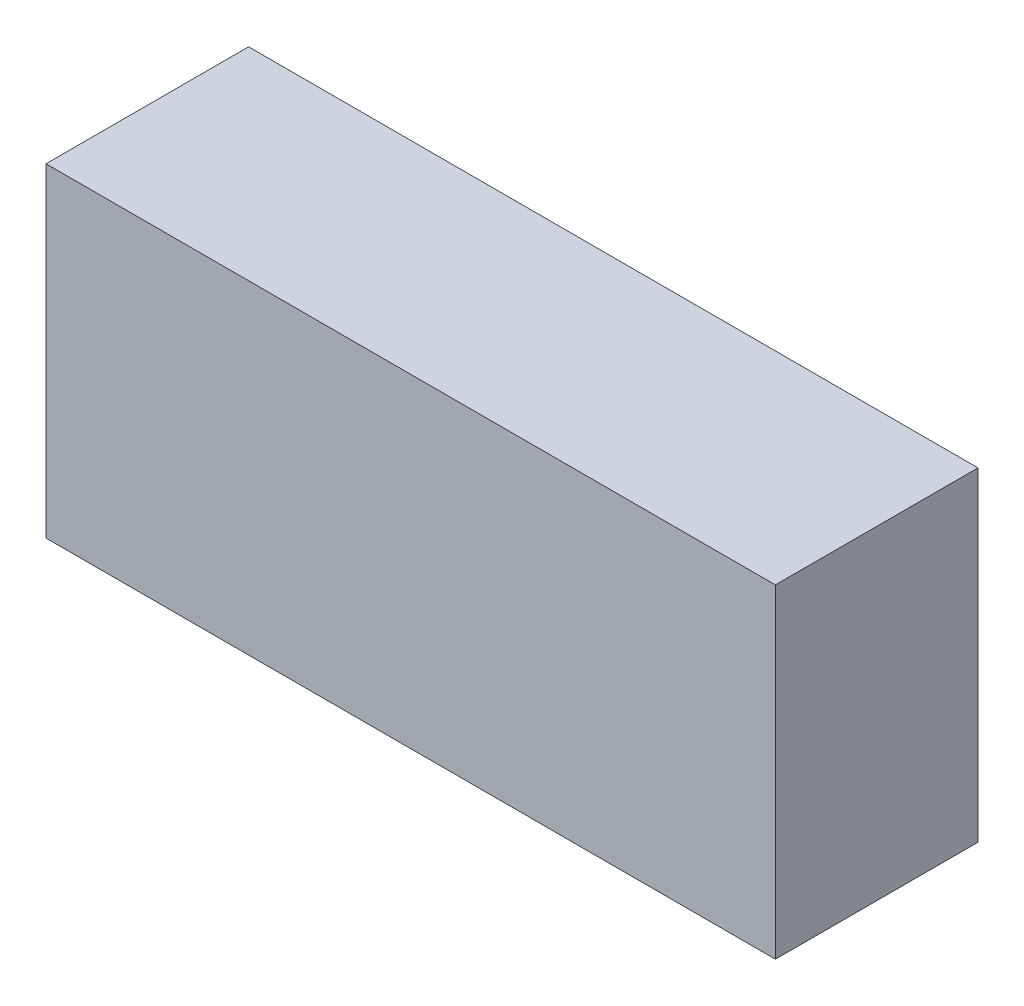
ISO-10303-21;
HEADER;
FILE_DESCRIPTION(('STEP AP214'),'2;1');
FILE_NAME('part.step','',(''),(''),'','','');
FILE_SCHEMA(('AUTOMOTIVE_DESIGN { 1 0 10303 214 1 1 1 1 }'));
ENDSEC;
DATA;
#1=APPLICATION_CONTEXT('core data for automotive mechanical design processes');
#2=APPLICATION_PROTOCOL_DEFINITION('international standard','automotive_design',2000,#1);
#3=PRODUCT_CONTEXT('',#1,'mechanical');
#4=PRODUCT('Part','Part','',(#3));
#5=PRODUCT_RELATED_PRODUCT_CATEGORY('part','',(#4));
#6=PRODUCT_DEFINITION_FORMATION('','',#4);
#7=PRODUCT_DEFINITION_CONTEXT('part definition',#1,'design');
#8=PRODUCT_DEFINITION('design','',#6,#7);
#9=PRODUCT_DEFINITION_SHAPE('','',#8);
#10=(LENGTH_UNIT() NAMED_UNIT(*) SI_UNIT(.MILLI.,.METRE.));
#11=(NAMED_UNIT(*) PLANE_ANGLE_UNIT() SI_UNIT($,.RADIAN.));
#12=(NAMED_UNIT(*) SI_UNIT($,.STERADIAN.) SOLID_ANGLE_UNIT());
#13=UNCERTAINTY_MEASURE_WITH_UNIT(LENGTH_MEASURE(1.E-05),#10,'distance_accuracy_value','');
#14=(GEOMETRIC_REPRESENTATION_CONTEXT(3) GLOBAL_UNCERTAINTY_ASSIGNED_CONTEXT((#13)) GLOBAL_UNIT_ASSIGNED_CONTEXT((#10,
#11,#12)) REPRESENTATION_CONTEXT('',''));
#15=CARTESIAN_POINT('',(0.,0.,0.));
#16=DIRECTION('',(0.,0.,1.));
#17=DIRECTION('',(1.,0.,0.));
#18=AXIS2_PLACEMENT_3D('',#15,#16,#17);
#19=CARTESIAN_POINT('',(36.,16.,10.));
#20=DIRECTION('',(-1.,0.,0.));
#21=DIRECTION('',(0.,-1.,0.));
#22=AXIS2_PLACEMENT_3D('',#19,#20,#21);
#23=PLANE('',#22);
#24=DIRECTION('',(0.,1.,0.));
#25=VECTOR('',#24,1.);
#26=CARTESIAN_POINT('',(36.,16.,-10.));
#27=LINE('',#26,#25);
#28=CARTESIAN_POINT('',(36.,-16.,-10.));
#29=VERTEX_POINT('',#28);
#30=CARTESIAN_POINT('',(36.,16.,-10.));
#31=VERTEX_POINT('',#30);
#32=EDGE_CURVE('E97',#29,#31,#27,.T.);
#33=ORIENTED_EDGE('',*,*,#32,.T.);
#34=DIRECTION('',(0.,0.,-1.));
#35=VECTOR('',#34,1.);
#36=CARTESIAN_POINT('',(36.,16.,10.));
#37=LINE('',#36,#35);
#38=CARTESIAN_POINT('',(36.,16.,10.));
#39=VERTEX_POINT('',#38);
#40=EDGE_CURVE('E11',#39,#31,#37,.T.);
#41=ORIENTED_EDGE('',*,*,#40,.F.);
#42=DIRECTION('',(0.,1.,0.));
#43=VECTOR('',#42,1.);
#44=CARTESIAN_POINT('',(36.,16.,10.));
#45=LINE('',#44,#43);
#46=CARTESIAN_POINT('',(36.,-16.,10.));
#47=VERTEX_POINT('',#46);
#48=EDGE_CURVE('E85',#47,#39,#45,.T.);
#49=ORIENTED_EDGE('',*,*,#48,.F.);
#50=DIRECTION('',(0.,0.,-1.));
#51=VECTOR('',#50,1.);
#52=CARTESIAN_POINT('',(36.,-16.,10.));
#53=LINE('',#52,#51);
#54=EDGE_CURVE('E93',#47,#29,#53,.T.);
#55=ORIENTED_EDGE('',*,*,#54,.T.);
#56=EDGE_LOOP('',(#33,#41,#49,#55));
#57=FACE_BOUND('',#56,.T.);
#58=ADVANCED_FACE('F34',(#57),#23,.F.);
#59=CARTESIAN_POINT('',(-36.,16.,10.));
#60=DIRECTION('',(0.,-1.,0.));
#61=DIRECTION('',(0.,0.,-1.));
#62=AXIS2_PLACEMENT_3D('',#59,#60,#61);
#63=PLANE('',#62);
#64=DIRECTION('',(-1.,0.,0.));
#65=VECTOR('',#64,1.);
#66=CARTESIAN_POINT('',(-36.,16.,-10.));
#67=LINE('',#66,#65);
#68=CARTESIAN_POINT('',(-36.,16.,-10.));
#69=VERTEX_POINT('',#68);
#70=EDGE_CURVE('E89',#31,#69,#67,.T.);
#71=ORIENTED_EDGE('',*,*,#70,.T.);
#72=DIRECTION('',(0.,0.,-1.));
#73=VECTOR('',#72,1.);
#74=CARTESIAN_POINT('',(-36.,16.,10.));
#75=LINE('',#74,#73);
#76=CARTESIAN_POINT('',(-36.,16.,10.));
#77=VERTEX_POINT('',#76);
#78=EDGE_CURVE('E42',#77,#69,#75,.T.);
#79=ORIENTED_EDGE('',*,*,#78,.F.);
#80=DIRECTION('',(-1.,0.,0.));
#81=VECTOR('',#80,1.);
#82=CARTESIAN_POINT('',(-36.,16.,10.));
#83=LINE('',#82,#81);
#84=EDGE_CURVE('E80',#39,#77,#83,.T.);
#85=ORIENTED_EDGE('',*,*,#84,.F.);
#86=ORIENTED_EDGE('',*,*,#40,.T.);
#87=EDGE_LOOP('',(#71,#79,#85,#86));
#88=FACE_BOUND('',#87,.T.);
#89=ADVANCED_FACE('F88',(#88),#63,.F.);
#90=CARTESIAN_POINT('',(-36.,16.,10.));
#91=DIRECTION('',(1.,0.,0.));
#92=DIRECTION('',(0.,0.,-1.));
#93=AXIS2_PLACEMENT_3D('',#90,#91,#92);
#94=PLANE('',#93);
#95=DIRECTION('',(0.,-1.,0.));
#96=VECTOR('',#95,1.);
#97=CARTESIAN_POINT('',(-36.,16.,-10.));
#98=LINE('',#97,#96);
#99=CARTESIAN_POINT('',(-36.,-16.,-10.));
#100=VERTEX_POINT('',#99);
#101=EDGE_CURVE('E67',#69,#100,#98,.T.);
#102=ORIENTED_EDGE('',*,*,#101,.T.);
#103=DIRECTION('',(0.,0.,-1.));
#104=VECTOR('',#103,1.);
#105=CARTESIAN_POINT('',(-36.,-16.,10.));
#106=LINE('',#105,#104);
#107=CARTESIAN_POINT('',(-36.,-16.,10.));
#108=VERTEX_POINT('',#107);
#109=EDGE_CURVE('E90',#108,#100,#106,.T.);
#110=ORIENTED_EDGE('',*,*,#109,.F.);
#111=DIRECTION('',(0.,-1.,0.));
#112=VECTOR('',#111,1.);
#113=CARTESIAN_POINT('',(-36.,16.,10.));
#114=LINE('',#113,#112);
#115=EDGE_CURVE('E83',#77,#108,#114,.T.);
#116=ORIENTED_EDGE('',*,*,#115,.F.);
#117=ORIENTED_EDGE('',*,*,#78,.T.);
#118=EDGE_LOOP('',(#102,#110,#116,#117));
#119=FACE_BOUND('',#118,.T.);
#120=ADVANCED_FACE('F91',(#119),#94,.F.);
#121=CARTESIAN_POINT('',(-36.,-16.,10.));
#122=DIRECTION('',(0.,1.,0.));
#123=DIRECTION('',(0.,0.,1.));
#124=AXIS2_PLACEMENT_3D('',#121,#122,#123);
#125=PLANE('',#124);
#126=DIRECTION('',(1.,0.,0.));
#127=VECTOR('',#126,1.);
#128=CARTESIAN_POINT('',(-36.,-16.,-10.));
#129=LINE('',#128,#127);
#130=EDGE_CURVE('E73',#100,#29,#129,.T.);
#131=ORIENTED_EDGE('',*,*,#130,.T.);
#132=ORIENTED_EDGE('',*,*,#54,.F.);
#133=DIRECTION('',(1.,0.,0.));
#134=VECTOR('',#133,1.);
#135=CARTESIAN_POINT('',(-36.,-16.,10.));
#136=LINE('',#135,#134);
#137=EDGE_CURVE('E50',#108,#47,#136,.T.);
#138=ORIENTED_EDGE('',*,*,#137,.F.);
#139=ORIENTED_EDGE('',*,*,#109,.T.);
#140=EDGE_LOOP('',(#131,#132,#138,#139));
#141=FACE_BOUND('',#140,.T.);
#142=ADVANCED_FACE('F104',(#141),#125,.F.);
#143=CARTESIAN_POINT('',(0.,0.,10.));
#144=DIRECTION('',(0.,0.,1.));
#145=DIRECTION('',(1.,0.,0.));
#146=AXIS2_PLACEMENT_3D('',#143,#144,#145);
#147=PLANE('',#146);
#148=ORIENTED_EDGE('',*,*,#48,.T.);
#149=ORIENTED_EDGE('',*,*,#84,.T.);
#150=ORIENTED_EDGE('',*,*,#115,.T.);
#151=ORIENTED_EDGE('',*,*,#137,.T.);
#152=EDGE_LOOP('',(#148,#149,#150,#151));
#153=FACE_BOUND('',#152,.T.);
#154=ADVANCED_FACE('F81',(#153),#147,.T.);
#155=CARTESIAN_POINT('',(0.,0.,-10.));
#156=DIRECTION('',(0.,0.,1.));
#157=DIRECTION('',(1.,0.,0.));
#158=AXIS2_PLACEMENT_3D('',#155,#156,#157);
#159=PLANE('',#158);
#160=ORIENTED_EDGE('',*,*,#32,.F.);
#161=ORIENTED_EDGE('',*,*,#130,.F.);
#162=ORIENTED_EDGE('',*,*,#101,.F.);
#163=ORIENTED_EDGE('',*,*,#70,.F.);
#164=EDGE_LOOP('',(#160,#161,#162,#163));
#165=FACE_BOUND('',#164,.T.);
#166=ADVANCED_FACE('F107',(#165),#159,.F.);
#167=CLOSED_SHELL('',(#58,#89,#120,#142,#154,#166));
#168=MANIFOLD_SOLID_BREP('B2',#167);
#169=ADVANCED_BREP_SHAPE_REPRESENTATION('',(#18,#168),#14);
#170=SHAPE_DEFINITION_REPRESENTATION(#9,#169);
ENDSEC;
END-ISO-10303-21;
